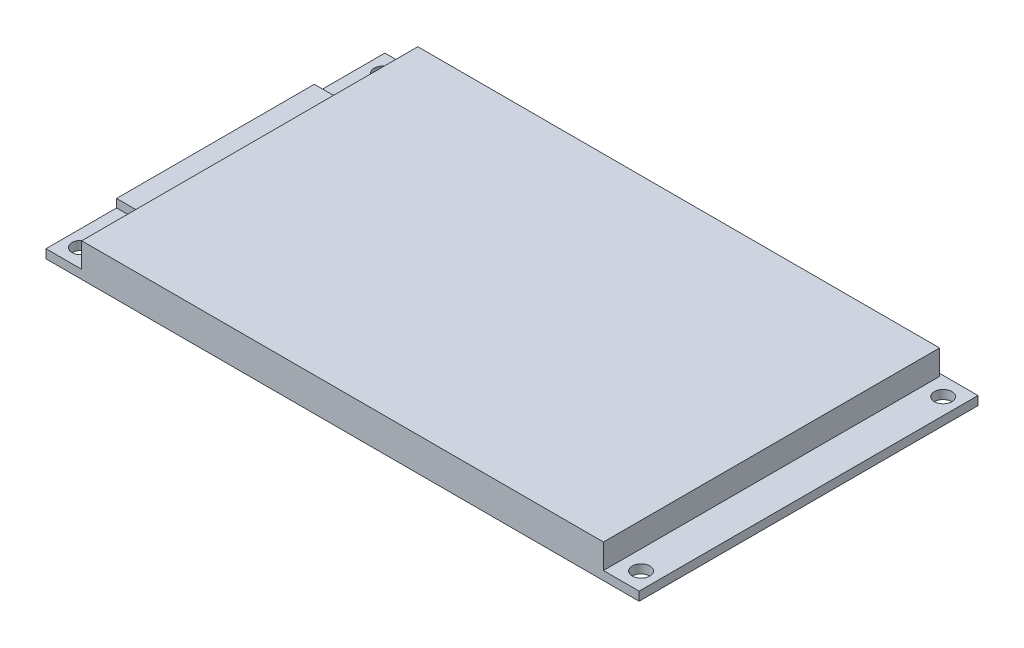
ISO-10303-21;
HEADER;
FILE_DESCRIPTION(('STEP AP214'),'2;1');
FILE_NAME('part.step','',(''),(''),'','','');
FILE_SCHEMA(('AUTOMOTIVE_DESIGN { 1 0 10303 214 1 1 1 1 }'));
ENDSEC;
DATA;
#1=APPLICATION_CONTEXT('core data for automotive mechanical design processes');
#2=APPLICATION_PROTOCOL_DEFINITION('international standard','automotive_design',2000,#1);
#3=PRODUCT_CONTEXT('',#1,'mechanical');
#4=PRODUCT('Part','Part','',(#3));
#5=PRODUCT_RELATED_PRODUCT_CATEGORY('part','',(#4));
#6=PRODUCT_DEFINITION_FORMATION('','',#4);
#7=PRODUCT_DEFINITION_CONTEXT('part definition',#1,'design');
#8=PRODUCT_DEFINITION('design','',#6,#7);
#9=PRODUCT_DEFINITION_SHAPE('','',#8);
#10=(LENGTH_UNIT() NAMED_UNIT(*) SI_UNIT(.MILLI.,.METRE.));
#11=(NAMED_UNIT(*) PLANE_ANGLE_UNIT() SI_UNIT($,.RADIAN.));
#12=(NAMED_UNIT(*) SI_UNIT($,.STERADIAN.) SOLID_ANGLE_UNIT());
#13=UNCERTAINTY_MEASURE_WITH_UNIT(LENGTH_MEASURE(1.E-05),#10,'distance_accuracy_value','');
#14=(GEOMETRIC_REPRESENTATION_CONTEXT(3) GLOBAL_UNCERTAINTY_ASSIGNED_CONTEXT((#13)) GLOBAL_UNIT_ASSIGNED_CONTEXT((#10,
#11,#12)) REPRESENTATION_CONTEXT('',''));
#15=CARTESIAN_POINT('',(0.,0.,0.));
#16=DIRECTION('',(0.,0.,1.));
#17=DIRECTION('',(1.,0.,0.));
#18=AXIS2_PLACEMENT_3D('',#15,#16,#17);
#19=CARTESIAN_POINT('',(0.,1.6,0.));
#20=DIRECTION('',(0.,1.,0.));
#21=DIRECTION('',(0.,0.,1.));
#22=AXIS2_PLACEMENT_3D('',#19,#20,#21);
#23=PLANE('',#22);
#24=CARTESIAN_POINT('',(-51.,1.6,-27.5));
#25=DIRECTION('',(0.,1.,0.));
#26=DIRECTION('',(0.,0.,1.));
#27=AXIS2_PLACEMENT_3D('',#24,#25,#26);
#28=CIRCLE('',#27,1.6);
#29=CARTESIAN_POINT('',(-51.,1.6,-25.9));
#30=VERTEX_POINT('',#29);
#31=EDGE_CURVE('E523',#30,#30,#28,.T.);
#32=ORIENTED_EDGE('',*,*,#31,.F.);
#33=EDGE_LOOP('',(#32));
#34=FACE_BOUND('',#33,.T.);
#35=CARTESIAN_POINT('',(-51.,1.6,27.5));
#36=DIRECTION('',(0.,1.,0.));
#37=DIRECTION('',(0.,0.,1.));
#38=AXIS2_PLACEMENT_3D('',#35,#36,#37);
#39=CIRCLE('',#38,1.6);
#40=CARTESIAN_POINT('',(-51.,1.6,29.1));
#41=VERTEX_POINT('',#40);
#42=EDGE_CURVE('E525',#41,#41,#39,.T.);
#43=ORIENTED_EDGE('',*,*,#42,.F.);
#44=EDGE_LOOP('',(#43));
#45=FACE_BOUND('',#44,.T.);
#46=CARTESIAN_POINT('',(51.,1.6,-27.5));
#47=DIRECTION('',(0.,1.,0.));
#48=DIRECTION('',(0.,0.,1.));
#49=AXIS2_PLACEMENT_3D('',#46,#47,#48);
#50=CIRCLE('',#49,1.6);
#51=CARTESIAN_POINT('',(51.,1.6,-25.9));
#52=VERTEX_POINT('',#51);
#53=EDGE_CURVE('E533',#52,#52,#50,.T.);
#54=ORIENTED_EDGE('',*,*,#53,.F.);
#55=EDGE_LOOP('',(#54));
#56=FACE_BOUND('',#55,.T.);
#57=CARTESIAN_POINT('',(51.,1.6,27.5));
#58=DIRECTION('',(0.,1.,0.));
#59=DIRECTION('',(0.,0.,1.));
#60=AXIS2_PLACEMENT_3D('',#57,#58,#59);
#61=CIRCLE('',#60,1.6);
#62=CARTESIAN_POINT('',(51.,1.6,29.1));
#63=VERTEX_POINT('',#62);
#64=EDGE_CURVE('E538',#63,#63,#61,.T.);
#65=ORIENTED_EDGE('',*,*,#64,.F.);
#66=EDGE_LOOP('',(#65));
#67=FACE_BOUND('',#66,.T.);
#68=DIRECTION('',(0.,0.,-1.));
#69=VECTOR('',#68,1.);
#70=CARTESIAN_POINT('',(-50.5,1.6,-18.));
#71=LINE('',#70,#69);
#72=CARTESIAN_POINT('',(-50.5,1.6,18.));
#73=VERTEX_POINT('',#72);
#74=CARTESIAN_POINT('',(-50.5,1.6,-18.));
#75=VERTEX_POINT('',#74);
#76=EDGE_CURVE('E200',#73,#75,#71,.T.);
#77=ORIENTED_EDGE('',*,*,#76,.F.);
#78=DIRECTION('',(1.,0.,0.));
#79=VECTOR('',#78,1.);
#80=CARTESIAN_POINT('',(-50.5,1.6,18.));
#81=LINE('',#80,#79);
#82=CARTESIAN_POINT('',(-54.,1.6,18.));
#83=VERTEX_POINT('',#82);
#84=EDGE_CURVE('E184',#83,#73,#81,.T.);
#85=ORIENTED_EDGE('',*,*,#84,.F.);
#86=DIRECTION('',(0.,0.,1.));
#87=VECTOR('',#86,1.);
#88=CARTESIAN_POINT('',(-54.,1.6,-30.85));
#89=LINE('',#88,#87);
#90=CARTESIAN_POINT('',(-54.,1.6,30.85));
#91=VERTEX_POINT('',#90);
#92=EDGE_CURVE('E248',#83,#91,#89,.T.);
#93=ORIENTED_EDGE('',*,*,#92,.T.);
#94=DIRECTION('',(1.,0.,0.));
#95=VECTOR('',#94,1.);
#96=CARTESIAN_POINT('',(-54.,1.6,30.85));
#97=LINE('',#96,#95);
#98=CARTESIAN_POINT('',(-47.5,1.6,30.85));
#99=VERTEX_POINT('',#98);
#100=EDGE_CURVE('E253',#91,#99,#97,.T.);
#101=ORIENTED_EDGE('',*,*,#100,.T.);
#102=DIRECTION('',(0.,0.,1.));
#103=VECTOR('',#102,1.);
#104=CARTESIAN_POINT('',(-47.5,1.6,-30.35));
#105=LINE('',#104,#103);
#106=CARTESIAN_POINT('',(-47.5,1.6,-30.35));
#107=VERTEX_POINT('',#106);
#108=EDGE_CURVE('E211',#107,#99,#105,.T.);
#109=ORIENTED_EDGE('',*,*,#108,.F.);
#110=DIRECTION('',(-1.,0.,0.));
#111=VECTOR('',#110,1.);
#112=CARTESIAN_POINT('',(-47.5,1.6,-30.35));
#113=LINE('',#112,#111);
#114=CARTESIAN_POINT('',(47.5,1.6,-30.35));
#115=VERTEX_POINT('',#114);
#116=EDGE_CURVE('E216',#115,#107,#113,.T.);
#117=ORIENTED_EDGE('',*,*,#116,.F.);
#118=DIRECTION('',(0.,0.,-1.));
#119=VECTOR('',#118,1.);
#120=CARTESIAN_POINT('',(47.5,1.6,-30.35));
#121=LINE('',#120,#119);
#122=CARTESIAN_POINT('',(47.5,1.6,30.85));
#123=VERTEX_POINT('',#122);
#124=EDGE_CURVE('E225',#123,#115,#121,.T.);
#125=ORIENTED_EDGE('',*,*,#124,.F.);
#126=CARTESIAN_POINT('',(54.,1.6,30.85));
#127=VERTEX_POINT('',#126);
#128=EDGE_CURVE('E252',#123,#127,#97,.T.);
#129=ORIENTED_EDGE('',*,*,#128,.T.);
#130=DIRECTION('',(0.,0.,-1.));
#131=VECTOR('',#130,1.);
#132=CARTESIAN_POINT('',(54.,1.6,-30.85));
#133=LINE('',#132,#131);
#134=CARTESIAN_POINT('',(54.,1.6,-30.85));
#135=VERTEX_POINT('',#134);
#136=EDGE_CURVE('E242',#127,#135,#133,.T.);
#137=ORIENTED_EDGE('',*,*,#136,.T.);
#138=DIRECTION('',(-1.,0.,0.));
#139=VECTOR('',#138,1.);
#140=CARTESIAN_POINT('',(-54.,1.6,-30.85));
#141=LINE('',#140,#139);
#142=CARTESIAN_POINT('',(-54.,1.6,-30.85));
#143=VERTEX_POINT('',#142);
#144=EDGE_CURVE('E245',#135,#143,#141,.T.);
#145=ORIENTED_EDGE('',*,*,#144,.T.);
#146=CARTESIAN_POINT('',(-54.,1.6,-18.));
#147=VERTEX_POINT('',#146);
#148=EDGE_CURVE('E249',#143,#147,#89,.T.);
#149=ORIENTED_EDGE('',*,*,#148,.T.);
#150=DIRECTION('',(-1.,0.,0.));
#151=VECTOR('',#150,1.);
#152=CARTESIAN_POINT('',(-50.5,1.6,-18.));
#153=LINE('',#152,#151);
#154=EDGE_CURVE('E192',#75,#147,#153,.T.);
#155=ORIENTED_EDGE('',*,*,#154,.F.);
#156=EDGE_LOOP('',(#77,#85,#93,#101,#109,#117,#125,#129,#137,#145,#149,#155));
#157=FACE_BOUND('',#156,.T.);
#158=ADVANCED_FACE('F32',(#34,#45,#56,#67,#157),#23,.T.);
#159=CARTESIAN_POINT('',(54.,1.6,-30.85));
#160=DIRECTION('',(-1.,0.,0.));
#161=DIRECTION('',(0.,0.,1.));
#162=AXIS2_PLACEMENT_3D('',#159,#160,#161);
#163=PLANE('',#162);
#164=DIRECTION('',(0.,0.,-1.));
#165=VECTOR('',#164,1.);
#166=CARTESIAN_POINT('',(54.,0.,-30.85));
#167=LINE('',#166,#165);
#168=CARTESIAN_POINT('',(54.,0.,30.85));
#169=VERTEX_POINT('',#168);
#170=CARTESIAN_POINT('',(54.,0.,-30.85));
#171=VERTEX_POINT('',#170);
#172=EDGE_CURVE('E241',#169,#171,#167,.T.);
#173=ORIENTED_EDGE('',*,*,#172,.T.);
#174=DIRECTION('',(0.,-1.,0.));
#175=VECTOR('',#174,1.);
#176=CARTESIAN_POINT('',(54.,1.6,-30.85));
#177=LINE('',#176,#175);
#178=EDGE_CURVE('E11',#135,#171,#177,.T.);
#179=ORIENTED_EDGE('',*,*,#178,.F.);
#180=ORIENTED_EDGE('',*,*,#136,.F.);
#181=DIRECTION('',(0.,-1.,0.));
#182=VECTOR('',#181,1.);
#183=CARTESIAN_POINT('',(54.,1.6,30.85));
#184=LINE('',#183,#182);
#185=EDGE_CURVE('E255',#127,#169,#184,.T.);
#186=ORIENTED_EDGE('',*,*,#185,.T.);
#187=EDGE_LOOP('',(#173,#179,#180,#186));
#188=FACE_BOUND('',#187,.T.);
#189=ADVANCED_FACE('F34',(#188),#163,.F.);
#190=CARTESIAN_POINT('',(-54.,1.6,-30.85));
#191=DIRECTION('',(0.,0.,1.));
#192=DIRECTION('',(1.,0.,0.));
#193=AXIS2_PLACEMENT_3D('',#190,#191,#192);
#194=PLANE('',#193);
#195=DIRECTION('',(-1.,0.,0.));
#196=VECTOR('',#195,1.);
#197=CARTESIAN_POINT('',(-54.,0.,-30.85));
#198=LINE('',#197,#196);
#199=CARTESIAN_POINT('',(-54.,0.,-30.85));
#200=VERTEX_POINT('',#199);
#201=EDGE_CURVE('E258',#171,#200,#198,.T.);
#202=ORIENTED_EDGE('',*,*,#201,.T.);
#203=DIRECTION('',(0.,-1.,0.));
#204=VECTOR('',#203,1.);
#205=CARTESIAN_POINT('',(-54.,1.6,-30.85));
#206=LINE('',#205,#204);
#207=EDGE_CURVE('E40',#143,#200,#206,.T.);
#208=ORIENTED_EDGE('',*,*,#207,.F.);
#209=ORIENTED_EDGE('',*,*,#144,.F.);
#210=ORIENTED_EDGE('',*,*,#178,.T.);
#211=EDGE_LOOP('',(#202,#208,#209,#210));
#212=FACE_BOUND('',#211,.T.);
#213=ADVANCED_FACE('F304',(#212),#194,.F.);
#214=CARTESIAN_POINT('',(-54.,1.6,-30.85));
#215=DIRECTION('',(1.,0.,0.));
#216=DIRECTION('',(0.,0.,-1.));
#217=AXIS2_PLACEMENT_3D('',#214,#215,#216);
#218=PLANE('',#217);
#219=DIRECTION('',(0.,0.,1.));
#220=VECTOR('',#219,1.);
#221=CARTESIAN_POINT('',(-54.,0.,-30.85));
#222=LINE('',#221,#220);
#223=CARTESIAN_POINT('',(-54.,0.,-18.));
#224=VERTEX_POINT('',#223);
#225=EDGE_CURVE('E261',#200,#224,#222,.T.);
#226=ORIENTED_EDGE('',*,*,#225,.T.);
#227=DIRECTION('',(0.,1.,0.));
#228=VECTOR('',#227,1.);
#229=CARTESIAN_POINT('',(-54.,-8.5,-18.));
#230=LINE('',#229,#228);
#231=CARTESIAN_POINT('',(-54.,-8.5,-18.));
#232=VERTEX_POINT('',#231);
#233=EDGE_CURVE('E47',#232,#224,#230,.T.);
#234=ORIENTED_EDGE('',*,*,#233,.F.);
#235=DIRECTION('',(0.,0.,1.));
#236=VECTOR('',#235,1.);
#237=CARTESIAN_POINT('',(-54.,-8.5,0.));
#238=LINE('',#237,#236);
#239=CARTESIAN_POINT('',(-54.,-8.5,18.));
#240=VERTEX_POINT('',#239);
#241=EDGE_CURVE('E164',#232,#240,#238,.T.);
#242=ORIENTED_EDGE('',*,*,#241,.T.);
#243=DIRECTION('',(0.,1.,0.));
#244=VECTOR('',#243,1.);
#245=CARTESIAN_POINT('',(-54.,-8.5,18.));
#246=LINE('',#245,#244);
#247=CARTESIAN_POINT('',(-54.,0.,18.));
#248=VERTEX_POINT('',#247);
#249=EDGE_CURVE('E147',#240,#248,#246,.T.);
#250=ORIENTED_EDGE('',*,*,#249,.T.);
#251=CARTESIAN_POINT('',(-54.,0.,30.85));
#252=VERTEX_POINT('',#251);
#253=EDGE_CURVE('E260',#248,#252,#222,.T.);
#254=ORIENTED_EDGE('',*,*,#253,.T.);
#255=DIRECTION('',(0.,-1.,0.));
#256=VECTOR('',#255,1.);
#257=CARTESIAN_POINT('',(-54.,1.6,30.85));
#258=LINE('',#257,#256);
#259=EDGE_CURVE('E266',#91,#252,#258,.T.);
#260=ORIENTED_EDGE('',*,*,#259,.F.);
#261=ORIENTED_EDGE('',*,*,#92,.F.);
#262=DIRECTION('',(0.,-1.,0.));
#263=VECTOR('',#262,1.);
#264=CARTESIAN_POINT('',(-54.,3.1,18.));
#265=LINE('',#264,#263);
#266=CARTESIAN_POINT('',(-54.,3.1,18.));
#267=VERTEX_POINT('',#266);
#268=EDGE_CURVE('E209',#267,#83,#265,.T.);
#269=ORIENTED_EDGE('',*,*,#268,.F.);
#270=DIRECTION('',(0.,0.,1.));
#271=VECTOR('',#270,1.);
#272=CARTESIAN_POINT('',(-54.,3.1,-18.));
#273=LINE('',#272,#271);
#274=CARTESIAN_POINT('',(-54.,3.1,-18.));
#275=VERTEX_POINT('',#274);
#276=EDGE_CURVE('E188',#275,#267,#273,.T.);
#277=ORIENTED_EDGE('',*,*,#276,.F.);
#278=DIRECTION('',(0.,-1.,0.));
#279=VECTOR('',#278,1.);
#280=CARTESIAN_POINT('',(-54.,3.1,-18.));
#281=LINE('',#280,#279);
#282=EDGE_CURVE('E198',#275,#147,#281,.T.);
#283=ORIENTED_EDGE('',*,*,#282,.T.);
#284=ORIENTED_EDGE('',*,*,#148,.F.);
#285=ORIENTED_EDGE('',*,*,#207,.T.);
#286=EDGE_LOOP('',(#226,#234,#242,#250,#254,#260,#261,#269,#277,#283,#284,#285));
#287=FACE_BOUND('',#286,.T.);
#288=ADVANCED_FACE('F169',(#287),#218,.F.);
#289=CARTESIAN_POINT('',(-54.,1.6,30.85));
#290=DIRECTION('',(0.,0.,-1.));
#291=DIRECTION('',(-1.,0.,0.));
#292=AXIS2_PLACEMENT_3D('',#289,#290,#291);
#293=PLANE('',#292);
#294=DIRECTION('',(1.,0.,0.));
#295=VECTOR('',#294,1.);
#296=CARTESIAN_POINT('',(-54.,0.,30.85));
#297=LINE('',#296,#295);
#298=EDGE_CURVE('E246',#252,#169,#297,.T.);
#299=ORIENTED_EDGE('',*,*,#298,.T.);
#300=ORIENTED_EDGE('',*,*,#185,.F.);
#301=ORIENTED_EDGE('',*,*,#128,.F.);
#302=DIRECTION('',(0.,-1.,0.));
#303=VECTOR('',#302,1.);
#304=CARTESIAN_POINT('',(47.5,6.1,30.85));
#305=LINE('',#304,#303);
#306=CARTESIAN_POINT('',(47.5,6.1,30.85));
#307=VERTEX_POINT('',#306);
#308=EDGE_CURVE('E235',#307,#123,#305,.T.);
#309=ORIENTED_EDGE('',*,*,#308,.F.);
#310=DIRECTION('',(1.,0.,0.));
#311=VECTOR('',#310,1.);
#312=CARTESIAN_POINT('',(-47.5,6.1,30.85));
#313=LINE('',#312,#311);
#314=CARTESIAN_POINT('',(-47.5,6.1,30.85));
#315=VERTEX_POINT('',#314);
#316=EDGE_CURVE('E215',#315,#307,#313,.T.);
#317=ORIENTED_EDGE('',*,*,#316,.F.);
#318=DIRECTION('',(0.,-1.,0.));
#319=VECTOR('',#318,1.);
#320=CARTESIAN_POINT('',(-47.5,6.1,30.85));
#321=LINE('',#320,#319);
#322=EDGE_CURVE('E238',#315,#99,#321,.T.);
#323=ORIENTED_EDGE('',*,*,#322,.T.);
#324=ORIENTED_EDGE('',*,*,#100,.F.);
#325=ORIENTED_EDGE('',*,*,#259,.T.);
#326=EDGE_LOOP('',(#299,#300,#301,#309,#317,#323,#324,#325));
#327=FACE_BOUND('',#326,.T.);
#328=ADVANCED_FACE('F285',(#327),#293,.F.);
#329=CARTESIAN_POINT('',(0.,0.,0.));
#330=DIRECTION('',(0.,1.,0.));
#331=DIRECTION('',(0.,0.,1.));
#332=AXIS2_PLACEMENT_3D('',#329,#330,#331);
#333=PLANE('',#332);
#334=CARTESIAN_POINT('',(-51.,0.,-27.5));
#335=DIRECTION('',(0.,1.,0.));
#336=DIRECTION('',(0.,0.,1.));
#337=AXIS2_PLACEMENT_3D('',#334,#335,#336);
#338=CIRCLE('',#337,1.6);
#339=CARTESIAN_POINT('',(-51.,0.,-25.9));
#340=VERTEX_POINT('',#339);
#341=EDGE_CURVE('E521',#340,#340,#338,.T.);
#342=ORIENTED_EDGE('',*,*,#341,.T.);
#343=EDGE_LOOP('',(#342));
#344=FACE_BOUND('',#343,.T.);
#345=CARTESIAN_POINT('',(-51.,0.,27.5));
#346=DIRECTION('',(0.,1.,0.));
#347=DIRECTION('',(0.,0.,1.));
#348=AXIS2_PLACEMENT_3D('',#345,#346,#347);
#349=CIRCLE('',#348,1.6);
#350=CARTESIAN_POINT('',(-51.,0.,29.1));
#351=VERTEX_POINT('',#350);
#352=EDGE_CURVE('E530',#351,#351,#349,.T.);
#353=ORIENTED_EDGE('',*,*,#352,.T.);
#354=EDGE_LOOP('',(#353));
#355=FACE_BOUND('',#354,.T.);
#356=CARTESIAN_POINT('',(51.,0.,-27.5));
#357=DIRECTION('',(0.,1.,0.));
#358=DIRECTION('',(0.,0.,1.));
#359=AXIS2_PLACEMENT_3D('',#356,#357,#358);
#360=CIRCLE('',#359,1.6);
#361=CARTESIAN_POINT('',(51.,0.,-25.9));
#362=VERTEX_POINT('',#361);
#363=EDGE_CURVE('E536',#362,#362,#360,.T.);
#364=ORIENTED_EDGE('',*,*,#363,.T.);
#365=EDGE_LOOP('',(#364));
#366=FACE_BOUND('',#365,.T.);
#367=CARTESIAN_POINT('',(51.,0.,27.5));
#368=DIRECTION('',(0.,1.,0.));
#369=DIRECTION('',(0.,0.,1.));
#370=AXIS2_PLACEMENT_3D('',#367,#368,#369);
#371=CIRCLE('',#370,1.6);
#372=CARTESIAN_POINT('',(51.,0.,29.1));
#373=VERTEX_POINT('',#372);
#374=EDGE_CURVE('E175',#373,#373,#371,.T.);
#375=ORIENTED_EDGE('',*,*,#374,.T.);
#376=EDGE_LOOP('',(#375));
#377=FACE_BOUND('',#376,.T.);
#378=ORIENTED_EDGE('',*,*,#253,.F.);
#379=DIRECTION('',(1.,0.,0.));
#380=VECTOR('',#379,1.);
#381=CARTESIAN_POINT('',(0.,0.,18.));
#382=LINE('',#381,#380);
#383=CARTESIAN_POINT('',(-50.5,0.,18.));
#384=VERTEX_POINT('',#383);
#385=EDGE_CURVE('E152',#248,#384,#382,.T.);
#386=ORIENTED_EDGE('',*,*,#385,.T.);
#387=DIRECTION('',(0.,0.,-1.));
#388=VECTOR('',#387,1.);
#389=CARTESIAN_POINT('',(-50.5,0.,0.));
#390=LINE('',#389,#388);
#391=CARTESIAN_POINT('',(-50.5,0.,-18.));
#392=VERTEX_POINT('',#391);
#393=EDGE_CURVE('E172',#384,#392,#390,.T.);
#394=ORIENTED_EDGE('',*,*,#393,.T.);
#395=DIRECTION('',(-1.,0.,0.));
#396=VECTOR('',#395,1.);
#397=CARTESIAN_POINT('',(0.,0.,-18.));
#398=LINE('',#397,#396);
#399=EDGE_CURVE('E170',#392,#224,#398,.T.);
#400=ORIENTED_EDGE('',*,*,#399,.T.);
#401=ORIENTED_EDGE('',*,*,#225,.F.);
#402=ORIENTED_EDGE('',*,*,#201,.F.);
#403=ORIENTED_EDGE('',*,*,#172,.F.);
#404=ORIENTED_EDGE('',*,*,#298,.F.);
#405=EDGE_LOOP('',(#378,#386,#394,#400,#401,#402,#403,#404));
#406=FACE_BOUND('',#405,.T.);
#407=ADVANCED_FACE('F274',(#344,#355,#366,#377,#406),#333,.F.);
#408=CARTESIAN_POINT('',(-47.5,6.1,-30.35));
#409=DIRECTION('',(1.,0.,0.));
#410=DIRECTION('',(0.,0.,-1.));
#411=AXIS2_PLACEMENT_3D('',#408,#409,#410);
#412=PLANE('',#411);
#413=ORIENTED_EDGE('',*,*,#108,.T.);
#414=ORIENTED_EDGE('',*,*,#322,.F.);
#415=DIRECTION('',(0.,0.,1.));
#416=VECTOR('',#415,1.);
#417=CARTESIAN_POINT('',(-47.5,6.1,-30.35));
#418=LINE('',#417,#416);
#419=CARTESIAN_POINT('',(-47.5,6.1,-30.35));
#420=VERTEX_POINT('',#419);
#421=EDGE_CURVE('E212',#420,#315,#418,.T.);
#422=ORIENTED_EDGE('',*,*,#421,.F.);
#423=DIRECTION('',(0.,-1.,0.));
#424=VECTOR('',#423,1.);
#425=CARTESIAN_POINT('',(-47.5,6.1,-30.35));
#426=LINE('',#425,#424);
#427=EDGE_CURVE('E222',#420,#107,#426,.T.);
#428=ORIENTED_EDGE('',*,*,#427,.T.);
#429=EDGE_LOOP('',(#413,#414,#422,#428));
#430=FACE_BOUND('',#429,.T.);
#431=ADVANCED_FACE('F318',(#430),#412,.F.);
#432=CARTESIAN_POINT('',(47.5,6.1,-30.35));
#433=DIRECTION('',(-1.,0.,0.));
#434=DIRECTION('',(0.,0.,1.));
#435=AXIS2_PLACEMENT_3D('',#432,#433,#434);
#436=PLANE('',#435);
#437=ORIENTED_EDGE('',*,*,#124,.T.);
#438=DIRECTION('',(0.,-1.,0.));
#439=VECTOR('',#438,1.);
#440=CARTESIAN_POINT('',(47.5,6.1,-30.35));
#441=LINE('',#440,#439);
#442=CARTESIAN_POINT('',(47.5,6.1,-30.35));
#443=VERTEX_POINT('',#442);
#444=EDGE_CURVE('E232',#443,#115,#441,.T.);
#445=ORIENTED_EDGE('',*,*,#444,.F.);
#446=DIRECTION('',(0.,0.,-1.));
#447=VECTOR('',#446,1.);
#448=CARTESIAN_POINT('',(47.5,6.1,-30.35));
#449=LINE('',#448,#447);
#450=EDGE_CURVE('E218',#307,#443,#449,.T.);
#451=ORIENTED_EDGE('',*,*,#450,.F.);
#452=ORIENTED_EDGE('',*,*,#308,.T.);
#453=EDGE_LOOP('',(#437,#445,#451,#452));
#454=FACE_BOUND('',#453,.T.);
#455=ADVANCED_FACE('F310',(#454),#436,.F.);
#456=CARTESIAN_POINT('',(-47.5,6.1,-30.35));
#457=DIRECTION('',(0.,0.,1.));
#458=DIRECTION('',(1.,0.,0.));
#459=AXIS2_PLACEMENT_3D('',#456,#457,#458);
#460=PLANE('',#459);
#461=ORIENTED_EDGE('',*,*,#116,.T.);
#462=ORIENTED_EDGE('',*,*,#427,.F.);
#463=DIRECTION('',(-1.,0.,0.));
#464=VECTOR('',#463,1.);
#465=CARTESIAN_POINT('',(-47.5,6.1,-30.35));
#466=LINE('',#465,#464);
#467=EDGE_CURVE('E220',#443,#420,#466,.T.);
#468=ORIENTED_EDGE('',*,*,#467,.F.);
#469=ORIENTED_EDGE('',*,*,#444,.T.);
#470=EDGE_LOOP('',(#461,#462,#468,#469));
#471=FACE_BOUND('',#470,.T.);
#472=ADVANCED_FACE('F320',(#471),#460,.F.);
#473=CARTESIAN_POINT('',(0.,6.1,0.));
#474=DIRECTION('',(0.,1.,0.));
#475=DIRECTION('',(0.,0.,1.));
#476=AXIS2_PLACEMENT_3D('',#473,#474,#475);
#477=PLANE('',#476);
#478=ORIENTED_EDGE('',*,*,#421,.T.);
#479=ORIENTED_EDGE('',*,*,#316,.T.);
#480=ORIENTED_EDGE('',*,*,#450,.T.);
#481=ORIENTED_EDGE('',*,*,#467,.T.);
#482=EDGE_LOOP('',(#478,#479,#480,#481));
#483=FACE_BOUND('',#482,.T.);
#484=ADVANCED_FACE('F314',(#483),#477,.T.);
#485=CARTESIAN_POINT('',(-50.5,3.1,18.));
#486=DIRECTION('',(0.,0.,-1.));
#487=DIRECTION('',(-1.,0.,0.));
#488=AXIS2_PLACEMENT_3D('',#485,#486,#487);
#489=PLANE('',#488);
#490=ORIENTED_EDGE('',*,*,#84,.T.);
#491=DIRECTION('',(0.,-1.,0.));
#492=VECTOR('',#491,1.);
#493=CARTESIAN_POINT('',(-50.5,3.1,18.));
#494=LINE('',#493,#492);
#495=CARTESIAN_POINT('',(-50.5,3.1,18.));
#496=VERTEX_POINT('',#495);
#497=EDGE_CURVE('E206',#496,#73,#494,.T.);
#498=ORIENTED_EDGE('',*,*,#497,.F.);
#499=DIRECTION('',(1.,0.,0.));
#500=VECTOR('',#499,1.);
#501=CARTESIAN_POINT('',(-50.5,3.1,18.));
#502=LINE('',#501,#500);
#503=EDGE_CURVE('E191',#267,#496,#502,.T.);
#504=ORIENTED_EDGE('',*,*,#503,.F.);
#505=ORIENTED_EDGE('',*,*,#268,.T.);
#506=EDGE_LOOP('',(#490,#498,#504,#505));
#507=FACE_BOUND('',#506,.T.);
#508=ADVANCED_FACE('F294',(#507),#489,.F.);
#509=CARTESIAN_POINT('',(-50.5,3.1,-18.));
#510=DIRECTION('',(-1.,0.,0.));
#511=DIRECTION('',(0.,0.,1.));
#512=AXIS2_PLACEMENT_3D('',#509,#510,#511);
#513=PLANE('',#512);
#514=ORIENTED_EDGE('',*,*,#76,.T.);
#515=DIRECTION('',(0.,-1.,0.));
#516=VECTOR('',#515,1.);
#517=CARTESIAN_POINT('',(-50.5,3.1,-18.));
#518=LINE('',#517,#516);
#519=CARTESIAN_POINT('',(-50.5,3.1,-18.));
#520=VERTEX_POINT('',#519);
#521=EDGE_CURVE('E55',#520,#75,#518,.T.);
#522=ORIENTED_EDGE('',*,*,#521,.F.);
#523=DIRECTION('',(0.,0.,-1.));
#524=VECTOR('',#523,1.);
#525=CARTESIAN_POINT('',(-50.5,3.1,-18.));
#526=LINE('',#525,#524);
#527=EDGE_CURVE('E194',#496,#520,#526,.T.);
#528=ORIENTED_EDGE('',*,*,#527,.F.);
#529=ORIENTED_EDGE('',*,*,#497,.T.);
#530=EDGE_LOOP('',(#514,#522,#528,#529));
#531=FACE_BOUND('',#530,.T.);
#532=ADVANCED_FACE('F394',(#531),#513,.F.);
#533=CARTESIAN_POINT('',(-50.5,3.1,-18.));
#534=DIRECTION('',(0.,0.,1.));
#535=DIRECTION('',(1.,0.,0.));
#536=AXIS2_PLACEMENT_3D('',#533,#534,#535);
#537=PLANE('',#536);
#538=ORIENTED_EDGE('',*,*,#154,.T.);
#539=ORIENTED_EDGE('',*,*,#282,.F.);
#540=DIRECTION('',(-1.,0.,0.));
#541=VECTOR('',#540,1.);
#542=CARTESIAN_POINT('',(-50.5,3.1,-18.));
#543=LINE('',#542,#541);
#544=EDGE_CURVE('E196',#520,#275,#543,.T.);
#545=ORIENTED_EDGE('',*,*,#544,.F.);
#546=ORIENTED_EDGE('',*,*,#521,.T.);
#547=EDGE_LOOP('',(#538,#539,#545,#546));
#548=FACE_BOUND('',#547,.T.);
#549=ADVANCED_FACE('F300',(#548),#537,.F.);
#550=CARTESIAN_POINT('',(0.,3.1,0.));
#551=DIRECTION('',(0.,-1.,0.));
#552=DIRECTION('',(0.,0.,-1.));
#553=AXIS2_PLACEMENT_3D('',#550,#551,#552);
#554=PLANE('',#553);
#555=ORIENTED_EDGE('',*,*,#276,.T.);
#556=ORIENTED_EDGE('',*,*,#503,.T.);
#557=ORIENTED_EDGE('',*,*,#527,.T.);
#558=ORIENTED_EDGE('',*,*,#544,.T.);
#559=EDGE_LOOP('',(#555,#556,#557,#558));
#560=FACE_BOUND('',#559,.T.);
#561=ADVANCED_FACE('F298',(#560),#554,.F.);
#562=CARTESIAN_POINT('',(0.,-8.5,-18.));
#563=DIRECTION('',(0.,0.,-1.));
#564=DIRECTION('',(-1.,0.,0.));
#565=AXIS2_PLACEMENT_3D('',#562,#563,#564);
#566=PLANE('',#565);
#567=ORIENTED_EDGE('',*,*,#399,.F.);
#568=DIRECTION('',(0.,1.,0.));
#569=VECTOR('',#568,1.);
#570=CARTESIAN_POINT('',(-50.5,-8.5,-18.));
#571=LINE('',#570,#569);
#572=CARTESIAN_POINT('',(-50.5,-8.5,-18.));
#573=VERTEX_POINT('',#572);
#574=EDGE_CURVE('E185',#573,#392,#571,.T.);
#575=ORIENTED_EDGE('',*,*,#574,.F.);
#576=DIRECTION('',(-1.,0.,0.));
#577=VECTOR('',#576,1.);
#578=CARTESIAN_POINT('',(0.,-8.5,-18.));
#579=LINE('',#578,#577);
#580=EDGE_CURVE('E157',#573,#232,#579,.T.);
#581=ORIENTED_EDGE('',*,*,#580,.T.);
#582=ORIENTED_EDGE('',*,*,#233,.T.);
#583=EDGE_LOOP('',(#567,#575,#581,#582));
#584=FACE_BOUND('',#583,.T.);
#585=ADVANCED_FACE('F277',(#584),#566,.T.);
#586=CARTESIAN_POINT('',(-50.5,-8.5,0.));
#587=DIRECTION('',(1.,0.,0.));
#588=DIRECTION('',(0.,0.,-1.));
#589=AXIS2_PLACEMENT_3D('',#586,#587,#588);
#590=PLANE('',#589);
#591=ORIENTED_EDGE('',*,*,#393,.F.);
#592=DIRECTION('',(0.,1.,0.));
#593=VECTOR('',#592,1.);
#594=CARTESIAN_POINT('',(-50.5,-8.5,18.));
#595=LINE('',#594,#593);
#596=CARTESIAN_POINT('',(-50.5,-8.5,18.));
#597=VERTEX_POINT('',#596);
#598=EDGE_CURVE('E156',#597,#384,#595,.T.);
#599=ORIENTED_EDGE('',*,*,#598,.F.);
#600=DIRECTION('',(0.,0.,-1.));
#601=VECTOR('',#600,1.);
#602=CARTESIAN_POINT('',(-50.5,-8.5,0.));
#603=LINE('',#602,#601);
#604=EDGE_CURVE('E166',#597,#573,#603,.T.);
#605=ORIENTED_EDGE('',*,*,#604,.T.);
#606=ORIENTED_EDGE('',*,*,#574,.T.);
#607=EDGE_LOOP('',(#591,#599,#605,#606));
#608=FACE_BOUND('',#607,.T.);
#609=ADVANCED_FACE('F279',(#608),#590,.T.);
#610=CARTESIAN_POINT('',(0.,-8.5,18.));
#611=DIRECTION('',(0.,0.,1.));
#612=DIRECTION('',(1.,0.,0.));
#613=AXIS2_PLACEMENT_3D('',#610,#611,#612);
#614=PLANE('',#613);
#615=ORIENTED_EDGE('',*,*,#385,.F.);
#616=ORIENTED_EDGE('',*,*,#249,.F.);
#617=DIRECTION('',(1.,0.,0.));
#618=VECTOR('',#617,1.);
#619=CARTESIAN_POINT('',(0.,-8.5,18.));
#620=LINE('',#619,#618);
#621=EDGE_CURVE('E150',#240,#597,#620,.T.);
#622=ORIENTED_EDGE('',*,*,#621,.T.);
#623=ORIENTED_EDGE('',*,*,#598,.T.);
#624=EDGE_LOOP('',(#615,#616,#622,#623));
#625=FACE_BOUND('',#624,.T.);
#626=ADVANCED_FACE('F149',(#625),#614,.T.);
#627=CARTESIAN_POINT('',(0.,-8.5,0.));
#628=DIRECTION('',(0.,1.,0.));
#629=DIRECTION('',(0.,0.,1.));
#630=AXIS2_PLACEMENT_3D('',#627,#628,#629);
#631=PLANE('',#630);
#632=ORIENTED_EDGE('',*,*,#241,.F.);
#633=ORIENTED_EDGE('',*,*,#580,.F.);
#634=ORIENTED_EDGE('',*,*,#604,.F.);
#635=ORIENTED_EDGE('',*,*,#621,.F.);
#636=EDGE_LOOP('',(#632,#633,#634,#635));
#637=FACE_BOUND('',#636,.T.);
#638=ADVANCED_FACE('F162',(#637),#631,.F.);
#639=CARTESIAN_POINT('',(51.,1.6,27.5));
#640=DIRECTION('',(0.,1.,0.));
#641=DIRECTION('',(0.,0.,1.));
#642=AXIS2_PLACEMENT_3D('',#639,#640,#641);
#643=CYLINDRICAL_SURFACE('',#642,1.6);
#644=ORIENTED_EDGE('',*,*,#374,.F.);
#645=EDGE_LOOP('',(#644));
#646=FACE_BOUND('',#645,.T.);
#647=ORIENTED_EDGE('',*,*,#64,.T.);
#648=EDGE_LOOP('',(#647));
#649=FACE_BOUND('',#648,.T.);
#650=ADVANCED_FACE('F444',(#646,#649),#643,.F.);
#651=CARTESIAN_POINT('',(51.,1.6,-27.5));
#652=DIRECTION('',(0.,1.,0.));
#653=DIRECTION('',(0.,0.,1.));
#654=AXIS2_PLACEMENT_3D('',#651,#652,#653);
#655=CYLINDRICAL_SURFACE('',#654,1.6);
#656=ORIENTED_EDGE('',*,*,#363,.F.);
#657=EDGE_LOOP('',(#656));
#658=FACE_BOUND('',#657,.T.);
#659=ORIENTED_EDGE('',*,*,#53,.T.);
#660=EDGE_LOOP('',(#659));
#661=FACE_BOUND('',#660,.T.);
#662=ADVANCED_FACE('F450',(#658,#661),#655,.F.);
#663=CARTESIAN_POINT('',(-51.,1.6,27.5));
#664=DIRECTION('',(0.,1.,0.));
#665=DIRECTION('',(0.,0.,1.));
#666=AXIS2_PLACEMENT_3D('',#663,#664,#665);
#667=CYLINDRICAL_SURFACE('',#666,1.6);
#668=ORIENTED_EDGE('',*,*,#352,.F.);
#669=EDGE_LOOP('',(#668));
#670=FACE_BOUND('',#669,.T.);
#671=ORIENTED_EDGE('',*,*,#42,.T.);
#672=EDGE_LOOP('',(#671));
#673=FACE_BOUND('',#672,.T.);
#674=ADVANCED_FACE('F458',(#670,#673),#667,.F.);
#675=CARTESIAN_POINT('',(-51.,1.6,-27.5));
#676=DIRECTION('',(0.,1.,0.));
#677=DIRECTION('',(0.,0.,1.));
#678=AXIS2_PLACEMENT_3D('',#675,#676,#677);
#679=CYLINDRICAL_SURFACE('',#678,1.6);
#680=ORIENTED_EDGE('',*,*,#341,.F.);
#681=EDGE_LOOP('',(#680));
#682=FACE_BOUND('',#681,.T.);
#683=ORIENTED_EDGE('',*,*,#31,.T.);
#684=EDGE_LOOP('',(#683));
#685=FACE_BOUND('',#684,.T.);
#686=ADVANCED_FACE('F466',(#682,#685),#679,.F.);
#687=CLOSED_SHELL('',(#158,#189,#213,#288,#328,#407,#431,#455,#472,#484,#508,#532,#549,#561,
#585,#609,#626,#638,#650,#662,#674,#686));
#688=MANIFOLD_SOLID_BREP('B2',#687);
#689=ADVANCED_BREP_SHAPE_REPRESENTATION('',(#18,#688),#14);
#690=SHAPE_DEFINITION_REPRESENTATION(#9,#689);
ENDSEC;
END-ISO-10303-21;
